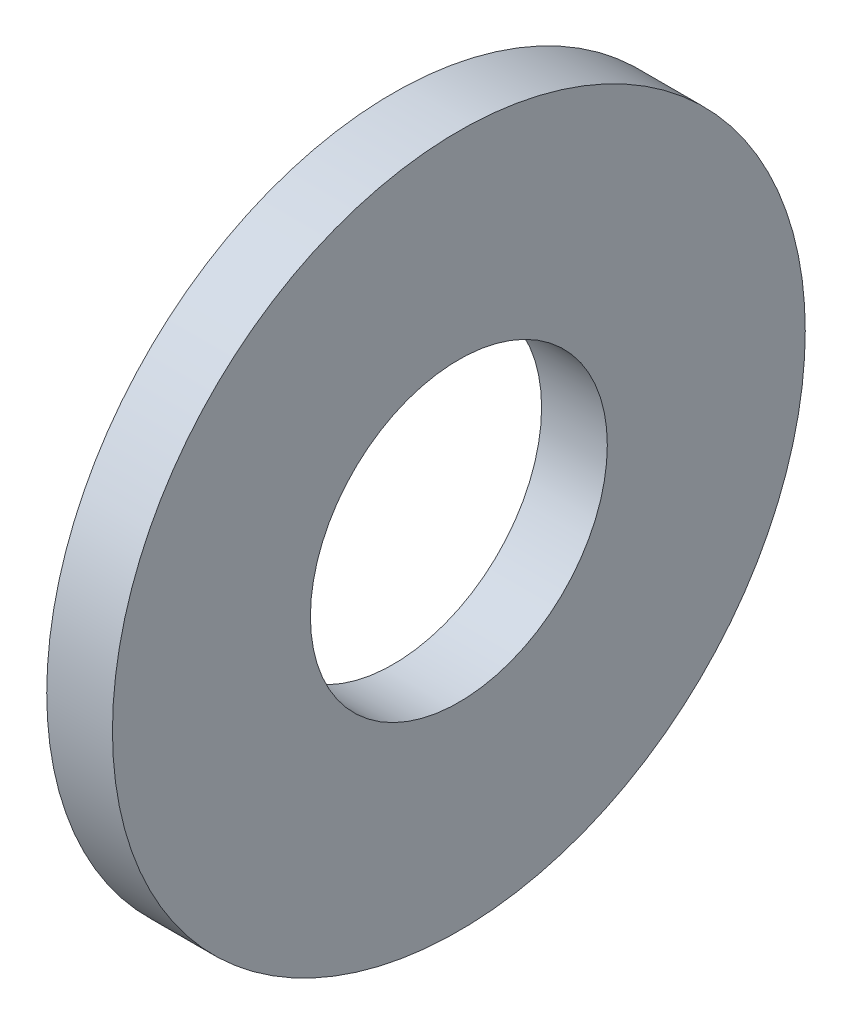
ISO-10303-21;
HEADER;
FILE_DESCRIPTION(('STEP AP214'),'2;1');
FILE_NAME('part.step','',(''),(''),'','','');
FILE_SCHEMA(('AUTOMOTIVE_DESIGN { 1 0 10303 214 1 1 1 1 }'));
ENDSEC;
DATA;
#1=APPLICATION_CONTEXT('core data for automotive mechanical design processes');
#2=APPLICATION_PROTOCOL_DEFINITION('international standard','automotive_design',2000,#1);
#3=PRODUCT_CONTEXT('',#1,'mechanical');
#4=PRODUCT('Part','Part','',(#3));
#5=PRODUCT_RELATED_PRODUCT_CATEGORY('part','',(#4));
#6=PRODUCT_DEFINITION_FORMATION('','',#4);
#7=PRODUCT_DEFINITION_CONTEXT('part definition',#1,'design');
#8=PRODUCT_DEFINITION('design','',#6,#7);
#9=PRODUCT_DEFINITION_SHAPE('','',#8);
#10=(LENGTH_UNIT() NAMED_UNIT(*) SI_UNIT(.MILLI.,.METRE.));
#11=(NAMED_UNIT(*) PLANE_ANGLE_UNIT() SI_UNIT($,.RADIAN.));
#12=(NAMED_UNIT(*) SI_UNIT($,.STERADIAN.) SOLID_ANGLE_UNIT());
#13=UNCERTAINTY_MEASURE_WITH_UNIT(LENGTH_MEASURE(1.E-05),#10,'distance_accuracy_value','');
#14=(GEOMETRIC_REPRESENTATION_CONTEXT(3) GLOBAL_UNCERTAINTY_ASSIGNED_CONTEXT((#13)) GLOBAL_UNIT_ASSIGNED_CONTEXT((#10,
#11,#12)) REPRESENTATION_CONTEXT('',''));
#15=CARTESIAN_POINT('',(0.,0.,0.));
#16=DIRECTION('',(0.,0.,1.));
#17=DIRECTION('',(1.,0.,0.));
#18=AXIS2_PLACEMENT_3D('',#15,#16,#17);
#19=CARTESIAN_POINT('',(2.1082,0.,0.));
#20=DIRECTION('',(1.,0.,0.));
#21=DIRECTION('',(0.,0.,-1.));
#22=AXIS2_PLACEMENT_3D('',#19,#20,#21);
#23=PLANE('',#22);
#24=CARTESIAN_POINT('',(2.1082,0.,0.));
#25=DIRECTION('',(1.,0.,0.));
#26=DIRECTION('',(0.,0.,-1.));
#27=AXIS2_PLACEMENT_3D('',#24,#25,#26);
#28=CIRCLE('',#27,11.1125);
#29=CARTESIAN_POINT('',(2.1082,0.,-11.1125));
#30=VERTEX_POINT('',#29);
#31=EDGE_CURVE('E12',#30,#30,#28,.T.);
#32=ORIENTED_EDGE('',*,*,#31,.T.);
#33=EDGE_LOOP('',(#32));
#34=FACE_BOUND('',#33,.T.);
#35=CARTESIAN_POINT('',(2.1082,0.,0.));
#36=DIRECTION('',(1.,0.,0.));
#37=DIRECTION('',(0.,0.,-1.));
#38=AXIS2_PLACEMENT_3D('',#35,#36,#37);
#39=CIRCLE('',#38,4.7625);
#40=CARTESIAN_POINT('',(2.1082,0.,-4.7625));
#41=VERTEX_POINT('',#40);
#42=EDGE_CURVE('E53',#41,#41,#39,.T.);
#43=ORIENTED_EDGE('',*,*,#42,.F.);
#44=EDGE_LOOP('',(#43));
#45=FACE_BOUND('',#44,.T.);
#46=ADVANCED_FACE('F42',(#34,#45),#23,.T.);
#47=CARTESIAN_POINT('',(0.,0.,0.));
#48=DIRECTION('',(1.,0.,0.));
#49=DIRECTION('',(0.,0.,-1.));
#50=AXIS2_PLACEMENT_3D('',#47,#48,#49);
#51=PLANE('',#50);
#52=CARTESIAN_POINT('',(0.,0.,0.));
#53=DIRECTION('',(1.,0.,0.));
#54=DIRECTION('',(0.,0.,-1.));
#55=AXIS2_PLACEMENT_3D('',#52,#53,#54);
#56=CIRCLE('',#55,11.1125);
#57=CARTESIAN_POINT('',(0.,0.,-11.1125));
#58=VERTEX_POINT('',#57);
#59=EDGE_CURVE('E46',#58,#58,#56,.T.);
#60=ORIENTED_EDGE('',*,*,#59,.F.);
#61=EDGE_LOOP('',(#60));
#62=FACE_BOUND('',#61,.T.);
#63=CARTESIAN_POINT('',(0.,0.,0.));
#64=DIRECTION('',(1.,0.,0.));
#65=DIRECTION('',(0.,0.,-1.));
#66=AXIS2_PLACEMENT_3D('',#63,#64,#65);
#67=CIRCLE('',#66,4.7625);
#68=CARTESIAN_POINT('',(0.,0.,-4.7625));
#69=VERTEX_POINT('',#68);
#70=EDGE_CURVE('E55',#69,#69,#67,.T.);
#71=ORIENTED_EDGE('',*,*,#70,.T.);
#72=EDGE_LOOP('',(#71));
#73=FACE_BOUND('',#72,.T.);
#74=ADVANCED_FACE('F65',(#62,#73),#51,.F.);
#75=CARTESIAN_POINT('',(2.1082,0.,0.));
#76=DIRECTION('',(-1.,0.,0.));
#77=DIRECTION('',(0.,0.,1.));
#78=AXIS2_PLACEMENT_3D('',#75,#76,#77);
#79=CYLINDRICAL_SURFACE('',#78,11.1125);
#80=ORIENTED_EDGE('',*,*,#31,.F.);
#81=EDGE_LOOP('',(#80));
#82=FACE_BOUND('',#81,.T.);
#83=ORIENTED_EDGE('',*,*,#59,.T.);
#84=EDGE_LOOP('',(#83));
#85=FACE_BOUND('',#84,.T.);
#86=ADVANCED_FACE('F44',(#82,#85),#79,.T.);
#87=CARTESIAN_POINT('',(2.1082,0.,0.));
#88=DIRECTION('',(-1.,0.,0.));
#89=DIRECTION('',(0.,0.,1.));
#90=AXIS2_PLACEMENT_3D('',#87,#88,#89);
#91=CYLINDRICAL_SURFACE('',#90,4.7625);
#92=ORIENTED_EDGE('',*,*,#42,.T.);
#93=EDGE_LOOP('',(#92));
#94=FACE_BOUND('',#93,.T.);
#95=ORIENTED_EDGE('',*,*,#70,.F.);
#96=EDGE_LOOP('',(#95));
#97=FACE_BOUND('',#96,.T.);
#98=ADVANCED_FACE('F61',(#94,#97),#91,.F.);
#99=CLOSED_SHELL('',(#46,#74,#86,#98));
#100=MANIFOLD_SOLID_BREP('B2',#99);
#101=ADVANCED_BREP_SHAPE_REPRESENTATION('',(#18,#100),#14);
#102=SHAPE_DEFINITION_REPRESENTATION(#9,#101);
ENDSEC;
END-ISO-10303-21;
